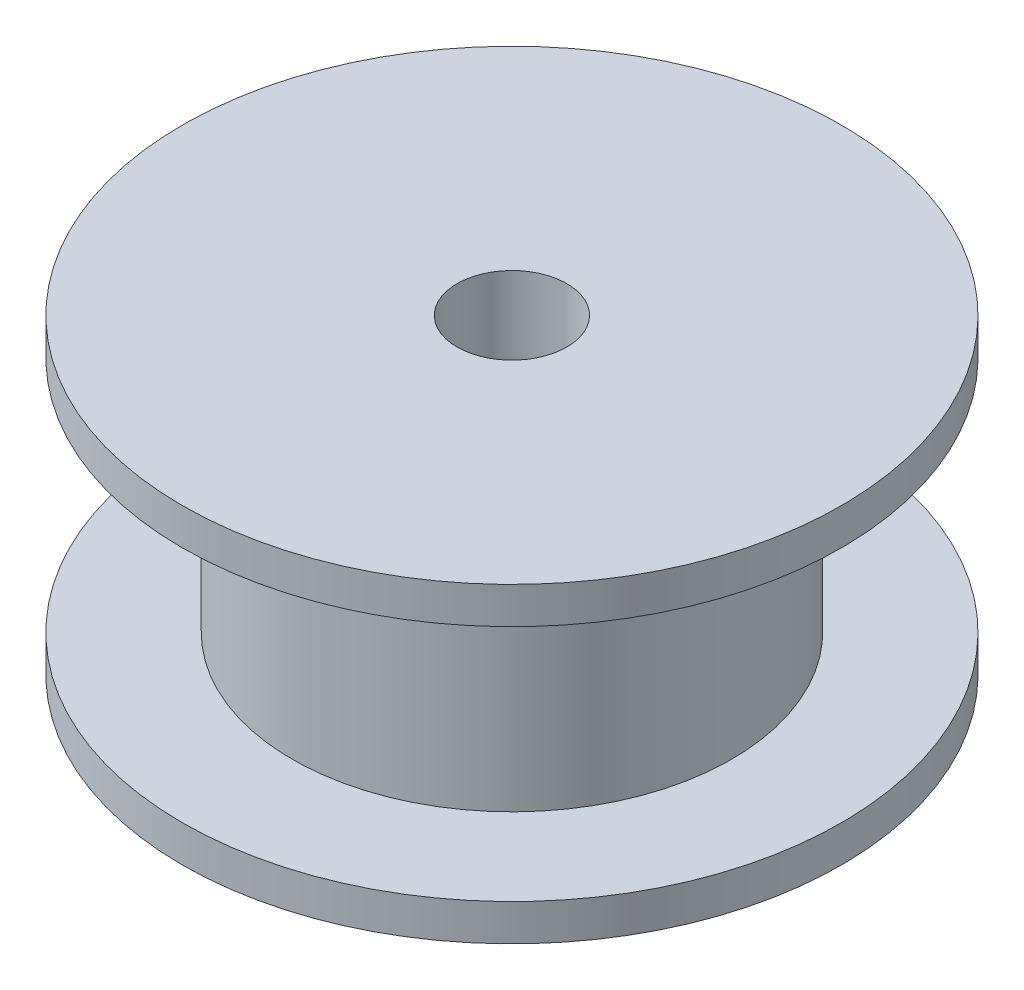
ISO-10303-21;
HEADER;
FILE_DESCRIPTION(('STEP AP214'),'2;1');
FILE_NAME('part.step','',(''),(''),'','','');
FILE_SCHEMA(('AUTOMOTIVE_DESIGN { 1 0 10303 214 1 1 1 1 }'));
ENDSEC;
DATA;
#1=APPLICATION_CONTEXT('core data for automotive mechanical design processes');
#2=APPLICATION_PROTOCOL_DEFINITION('international standard','automotive_design',2000,#1);
#3=PRODUCT_CONTEXT('',#1,'mechanical');
#4=PRODUCT('Part','Part','',(#3));
#5=PRODUCT_RELATED_PRODUCT_CATEGORY('part','',(#4));
#6=PRODUCT_DEFINITION_FORMATION('','',#4);
#7=PRODUCT_DEFINITION_CONTEXT('part definition',#1,'design');
#8=PRODUCT_DEFINITION('design','',#6,#7);
#9=PRODUCT_DEFINITION_SHAPE('','',#8);
#10=(LENGTH_UNIT() NAMED_UNIT(*) SI_UNIT(.MILLI.,.METRE.));
#11=(NAMED_UNIT(*) PLANE_ANGLE_UNIT() SI_UNIT($,.RADIAN.));
#12=(NAMED_UNIT(*) SI_UNIT($,.STERADIAN.) SOLID_ANGLE_UNIT());
#13=UNCERTAINTY_MEASURE_WITH_UNIT(LENGTH_MEASURE(1.E-05),#10,'distance_accuracy_value','');
#14=(GEOMETRIC_REPRESENTATION_CONTEXT(3) GLOBAL_UNCERTAINTY_ASSIGNED_CONTEXT((#13)) GLOBAL_UNIT_ASSIGNED_CONTEXT((#10,
#11,#12)) REPRESENTATION_CONTEXT('',''));
#15=CARTESIAN_POINT('',(0.,0.,0.));
#16=DIRECTION('',(0.,0.,1.));
#17=DIRECTION('',(1.,0.,0.));
#18=AXIS2_PLACEMENT_3D('',#15,#16,#17);
#19=CARTESIAN_POINT('',(0.,1.,0.));
#20=DIRECTION('',(0.,-1.,0.));
#21=DIRECTION('',(0.,0.,-1.));
#22=AXIS2_PLACEMENT_3D('',#19,#20,#21);
#23=CYLINDRICAL_SURFACE('',#22,9.);
#24=CARTESIAN_POINT('',(0.,1.,0.));
#25=DIRECTION('',(0.,1.,0.));
#26=DIRECTION('',(0.,0.,1.));
#27=AXIS2_PLACEMENT_3D('',#24,#25,#26);
#28=CIRCLE('',#27,9.);
#29=CARTESIAN_POINT('',(0.,1.,9.));
#30=VERTEX_POINT('',#29);
#31=EDGE_CURVE('E44',#30,#30,#28,.T.);
#32=ORIENTED_EDGE('',*,*,#31,.F.);
#33=EDGE_LOOP('',(#32));
#34=FACE_BOUND('',#33,.T.);
#35=CARTESIAN_POINT('',(0.,0.,0.));
#36=DIRECTION('',(0.,1.,0.));
#37=DIRECTION('',(0.,0.,1.));
#38=AXIS2_PLACEMENT_3D('',#35,#36,#37);
#39=CIRCLE('',#38,9.);
#40=CARTESIAN_POINT('',(0.,0.,9.));
#41=VERTEX_POINT('',#40);
#42=EDGE_CURVE('E40',#41,#41,#39,.T.);
#43=ORIENTED_EDGE('',*,*,#42,.T.);
#44=EDGE_LOOP('',(#43));
#45=FACE_BOUND('',#44,.T.);
#46=ADVANCED_FACE('F37',(#34,#45),#23,.T.);
#47=CARTESIAN_POINT('',(0.,1.,0.));
#48=DIRECTION('',(0.,1.,0.));
#49=DIRECTION('',(0.,0.,1.));
#50=AXIS2_PLACEMENT_3D('',#47,#48,#49);
#51=PLANE('',#50);
#52=CARTESIAN_POINT('',(0.,1.,0.));
#53=DIRECTION('',(0.,1.,0.));
#54=DIRECTION('',(0.,0.,1.));
#55=AXIS2_PLACEMENT_3D('',#52,#53,#54);
#56=CIRCLE('',#55,6.);
#57=CARTESIAN_POINT('',(0.,1.,-6.));
#58=VERTEX_POINT('',#57);
#59=EDGE_CURVE('E10',#58,#58,#56,.T.);
#60=ORIENTED_EDGE('',*,*,#59,.F.);
#61=EDGE_LOOP('',(#60));
#62=FACE_BOUND('',#61,.T.);
#63=ORIENTED_EDGE('',*,*,#31,.T.);
#64=EDGE_LOOP('',(#63));
#65=FACE_BOUND('',#64,.T.);
#66=ADVANCED_FACE('F96',(#62,#65),#51,.T.);
#67=CARTESIAN_POINT('',(0.,0.,0.));
#68=DIRECTION('',(0.,1.,0.));
#69=DIRECTION('',(0.,0.,1.));
#70=AXIS2_PLACEMENT_3D('',#67,#68,#69);
#71=PLANE('',#70);
#72=CARTESIAN_POINT('',(0.,0.,0.));
#73=DIRECTION('',(0.,1.,0.));
#74=DIRECTION('',(0.,0.,1.));
#75=AXIS2_PLACEMENT_3D('',#72,#73,#74);
#76=CIRCLE('',#75,1.5);
#77=CARTESIAN_POINT('',(0.,0.,1.5));
#78=VERTEX_POINT('',#77);
#79=EDGE_CURVE('E57',#78,#78,#76,.T.);
#80=ORIENTED_EDGE('',*,*,#79,.T.);
#81=EDGE_LOOP('',(#80));
#82=FACE_BOUND('',#81,.T.);
#83=ORIENTED_EDGE('',*,*,#42,.F.);
#84=EDGE_LOOP('',(#83));
#85=FACE_BOUND('',#84,.T.);
#86=ADVANCED_FACE('F66',(#82,#85),#71,.F.);
#87=CARTESIAN_POINT('',(0.,7.5,0.));
#88=DIRECTION('',(0.,-1.,0.));
#89=DIRECTION('',(0.,0.,-1.));
#90=AXIS2_PLACEMENT_3D('',#87,#88,#89);
#91=CYLINDRICAL_SURFACE('',#90,6.);
#92=CARTESIAN_POINT('',(0.,7.5,0.));
#93=DIRECTION('',(0.,1.,0.));
#94=DIRECTION('',(0.,0.,1.));
#95=AXIS2_PLACEMENT_3D('',#92,#93,#94);
#96=CIRCLE('',#95,6.);
#97=CARTESIAN_POINT('',(0.,7.5,-6.));
#98=VERTEX_POINT('',#97);
#99=EDGE_CURVE('E50',#98,#98,#96,.T.);
#100=CARTESIAN_POINT('',(0.,7.5,-6.));
#101=CARTESIAN_POINT('',(0.,7.43229166666667,-6.));
#102=CARTESIAN_POINT('',(0.,7.36458333333333,-6.));
#103=CARTESIAN_POINT('',(0.,7.22916666666667,-6.));
#104=CARTESIAN_POINT('',(0.,7.16145833333333,-6.));
#105=CARTESIAN_POINT('',(0.,7.02604166666667,-6.));
#106=CARTESIAN_POINT('',(0.,6.95833333333333,-6.));
#107=CARTESIAN_POINT('',(0.,6.82291666666667,-6.));
#108=CARTESIAN_POINT('',(0.,6.75520833333333,-6.));
#109=CARTESIAN_POINT('',(0.,6.61979166666667,-6.));
#110=CARTESIAN_POINT('',(0.,6.55208333333333,-6.));
#111=CARTESIAN_POINT('',(0.,6.41666666666667,-6.));
#112=CARTESIAN_POINT('',(0.,6.34895833333333,-6.));
#113=CARTESIAN_POINT('',(0.,6.21354166666667,-6.));
#114=CARTESIAN_POINT('',(0.,6.14583333333333,-6.));
#115=CARTESIAN_POINT('',(0.,6.01041666666667,-6.));
#116=CARTESIAN_POINT('',(0.,5.94270833333333,-6.));
#117=CARTESIAN_POINT('',(0.,5.80729166666667,-6.));
#118=CARTESIAN_POINT('',(0.,5.73958333333333,-6.));
#119=CARTESIAN_POINT('',(0.,5.60416666666667,-6.));
#120=CARTESIAN_POINT('',(0.,5.53645833333333,-6.));
#121=CARTESIAN_POINT('',(0.,5.40104166666667,-6.));
#122=CARTESIAN_POINT('',(0.,5.33333333333333,-6.));
#123=CARTESIAN_POINT('',(0.,5.19791666666667,-6.));
#124=CARTESIAN_POINT('',(0.,5.13020833333333,-6.));
#125=CARTESIAN_POINT('',(0.,4.99479166666667,-6.));
#126=CARTESIAN_POINT('',(0.,4.92708333333333,-6.));
#127=CARTESIAN_POINT('',(0.,4.79166666666667,-6.));
#128=CARTESIAN_POINT('',(0.,4.72395833333333,-6.));
#129=CARTESIAN_POINT('',(0.,4.58854166666667,-6.));
#130=CARTESIAN_POINT('',(0.,4.52083333333333,-6.));
#131=CARTESIAN_POINT('',(0.,4.38541666666667,-6.));
#132=CARTESIAN_POINT('',(0.,4.31770833333333,-6.));
#133=CARTESIAN_POINT('',(0.,4.18229166666667,-6.));
#134=CARTESIAN_POINT('',(0.,4.11458333333333,-6.));
#135=CARTESIAN_POINT('',(0.,3.97916666666667,-6.));
#136=CARTESIAN_POINT('',(0.,3.91145833333333,-6.));
#137=CARTESIAN_POINT('',(0.,3.77604166666667,-6.));
#138=CARTESIAN_POINT('',(0.,3.70833333333333,-6.));
#139=CARTESIAN_POINT('',(0.,3.57291666666667,-6.));
#140=CARTESIAN_POINT('',(0.,3.50520833333333,-6.));
#141=CARTESIAN_POINT('',(0.,3.36979166666667,-6.));
#142=CARTESIAN_POINT('',(0.,3.30208333333333,-6.));
#143=CARTESIAN_POINT('',(0.,3.16666666666667,-6.));
#144=CARTESIAN_POINT('',(0.,3.09895833333333,-6.));
#145=CARTESIAN_POINT('',(0.,2.96354166666667,-6.));
#146=CARTESIAN_POINT('',(0.,2.89583333333333,-6.));
#147=CARTESIAN_POINT('',(0.,2.76041666666667,-6.));
#148=CARTESIAN_POINT('',(0.,2.69270833333333,-6.));
#149=CARTESIAN_POINT('',(0.,2.55729166666667,-6.));
#150=CARTESIAN_POINT('',(0.,2.48958333333333,-6.));
#151=CARTESIAN_POINT('',(0.,2.35416666666667,-6.));
#152=CARTESIAN_POINT('',(0.,2.28645833333333,-6.));
#153=CARTESIAN_POINT('',(0.,2.15104166666667,-6.));
#154=CARTESIAN_POINT('',(0.,2.08333333333333,-6.));
#155=CARTESIAN_POINT('',(0.,1.94791666666667,-6.));
#156=CARTESIAN_POINT('',(0.,1.88020833333333,-6.));
#157=CARTESIAN_POINT('',(0.,1.74479166666667,-6.));
#158=CARTESIAN_POINT('',(0.,1.67708333333333,-6.));
#159=CARTESIAN_POINT('',(0.,1.54166666666667,-6.));
#160=CARTESIAN_POINT('',(0.,1.47395833333333,-6.));
#161=CARTESIAN_POINT('',(0.,1.33854166666667,-6.));
#162=CARTESIAN_POINT('',(0.,1.27083333333333,-6.));
#163=CARTESIAN_POINT('',(0.,1.13541666666667,-6.));
#164=CARTESIAN_POINT('',(0.,1.06770833333333,-6.));
#165=CARTESIAN_POINT('',(0.,1.,-6.));
#166=B_SPLINE_CURVE_WITH_KNOTS('',3,(#100,#101,#102,#103,#104,#105,#106,#107,#108,#109,#110,
#111,#112,#113,#114,#115,#116,#117,#118,#119,#120,#121,#122,#123,#124,#125,#126,#127,#128,#129,
#130,#131,#132,#133,#134,#135,#136,#137,#138,#139,#140,#141,#142,#143,#144,#145,#146,#147,#148,
#149,#150,#151,#152,#153,#154,#155,#156,#157,#158,#159,#160,#161,#162,#163,#164,#165),
.UNSPECIFIED.,.F.,.F.,(4,2,2,2,2,2,2,2,2,2,2,2,2,2,2,2,2,2,2,2,2,2,2,2,2,2,2,2,2,2,2,2,4),(0.,
0.203125,0.40625,0.609375000000001,0.812500000000001,1.015625,1.21875,1.421875,1.625,1.828125,
2.03125,2.234375,2.4375,2.640625,2.84375,3.046875,3.25,3.453125,3.65625,3.859375,4.0625,
4.265625,4.46875,4.671875,4.875,5.078125,5.28125,5.484375,5.6875,5.890625,6.09375,6.296875,6.5),.UNSPECIFIED.);
#167=EDGE_CURVE('BSEAM85',#98,#58,#166,.T.);
#168=ORIENTED_EDGE('',*,*,#99,.F.);
#169=ORIENTED_EDGE('',*,*,#59,.T.);
#170=ORIENTED_EDGE('',*,*,#167,.T.);
#171=ORIENTED_EDGE('',*,*,#167,.F.);
#172=EDGE_LOOP('',(#168,#170,#169,#171));
#173=FACE_BOUND('',#172,.T.);
#174=ADVANCED_FACE('F85',(#173),#91,.T.);
#175=CARTESIAN_POINT('',(0.,8.5,0.));
#176=DIRECTION('',(0.,-1.,0.));
#177=DIRECTION('',(0.,0.,-1.));
#178=AXIS2_PLACEMENT_3D('',#175,#176,#177);
#179=CYLINDRICAL_SURFACE('',#178,9.);
#180=CARTESIAN_POINT('',(0.,8.5,0.));
#181=DIRECTION('',(0.,1.,0.));
#182=DIRECTION('',(0.,0.,1.));
#183=AXIS2_PLACEMENT_3D('',#180,#181,#182);
#184=CIRCLE('',#183,9.);
#185=CARTESIAN_POINT('',(0.,8.5,9.));
#186=VERTEX_POINT('',#185);
#187=EDGE_CURVE('E53',#186,#186,#184,.T.);
#188=ORIENTED_EDGE('',*,*,#187,.F.);
#189=EDGE_LOOP('',(#188));
#190=FACE_BOUND('',#189,.T.);
#191=CARTESIAN_POINT('',(0.,7.5,0.));
#192=DIRECTION('',(0.,1.,0.));
#193=DIRECTION('',(0.,0.,1.));
#194=AXIS2_PLACEMENT_3D('',#191,#192,#193);
#195=CIRCLE('',#194,9.);
#196=CARTESIAN_POINT('',(0.,7.5,9.));
#197=VERTEX_POINT('',#196);
#198=EDGE_CURVE('E54',#197,#197,#195,.T.);
#199=ORIENTED_EDGE('',*,*,#198,.T.);
#200=EDGE_LOOP('',(#199));
#201=FACE_BOUND('',#200,.T.);
#202=ADVANCED_FACE('F79',(#190,#201),#179,.T.);
#203=CARTESIAN_POINT('',(0.,8.5,0.));
#204=DIRECTION('',(0.,1.,0.));
#205=DIRECTION('',(0.,0.,1.));
#206=AXIS2_PLACEMENT_3D('',#203,#204,#205);
#207=PLANE('',#206);
#208=CARTESIAN_POINT('',(0.,8.5,0.));
#209=DIRECTION('',(0.,1.,0.));
#210=DIRECTION('',(0.,0.,1.));
#211=AXIS2_PLACEMENT_3D('',#208,#209,#210);
#212=CIRCLE('',#211,1.5);
#213=CARTESIAN_POINT('',(0.,8.5,1.5));
#214=VERTEX_POINT('',#213);
#215=EDGE_CURVE('E60',#214,#214,#212,.T.);
#216=ORIENTED_EDGE('',*,*,#215,.F.);
#217=EDGE_LOOP('',(#216));
#218=FACE_BOUND('',#217,.T.);
#219=ORIENTED_EDGE('',*,*,#187,.T.);
#220=EDGE_LOOP('',(#219));
#221=FACE_BOUND('',#220,.T.);
#222=ADVANCED_FACE('F76',(#218,#221),#207,.T.);
#223=CARTESIAN_POINT('',(0.,7.5,0.));
#224=DIRECTION('',(0.,1.,0.));
#225=DIRECTION('',(0.,0.,1.));
#226=AXIS2_PLACEMENT_3D('',#223,#224,#225);
#227=PLANE('',#226);
#228=ORIENTED_EDGE('',*,*,#99,.T.);
#229=EDGE_LOOP('',(#228));
#230=FACE_BOUND('',#229,.T.);
#231=ORIENTED_EDGE('',*,*,#198,.F.);
#232=EDGE_LOOP('',(#231));
#233=FACE_BOUND('',#232,.T.);
#234=ADVANCED_FACE('F72',(#230,#233),#227,.F.);
#235=CARTESIAN_POINT('',(0.,0.,0.));
#236=DIRECTION('',(0.,1.,0.));
#237=DIRECTION('',(0.,0.,1.));
#238=AXIS2_PLACEMENT_3D('',#235,#236,#237);
#239=CYLINDRICAL_SURFACE('',#238,1.5);
#240=ORIENTED_EDGE('',*,*,#79,.F.);
#241=EDGE_LOOP('',(#240));
#242=FACE_BOUND('',#241,.T.);
#243=ORIENTED_EDGE('',*,*,#215,.T.);
#244=EDGE_LOOP('',(#243));
#245=FACE_BOUND('',#244,.T.);
#246=ADVANCED_FACE('F69',(#242,#245),#239,.F.);
#247=CLOSED_SHELL('',(#46,#66,#86,#174,#202,#222,#234,#246));
#248=MANIFOLD_SOLID_BREP('B2',#247);
#249=ADVANCED_BREP_SHAPE_REPRESENTATION('',(#18,#248),#14);
#250=SHAPE_DEFINITION_REPRESENTATION(#9,#249);
ENDSEC;
END-ISO-10303-21;
